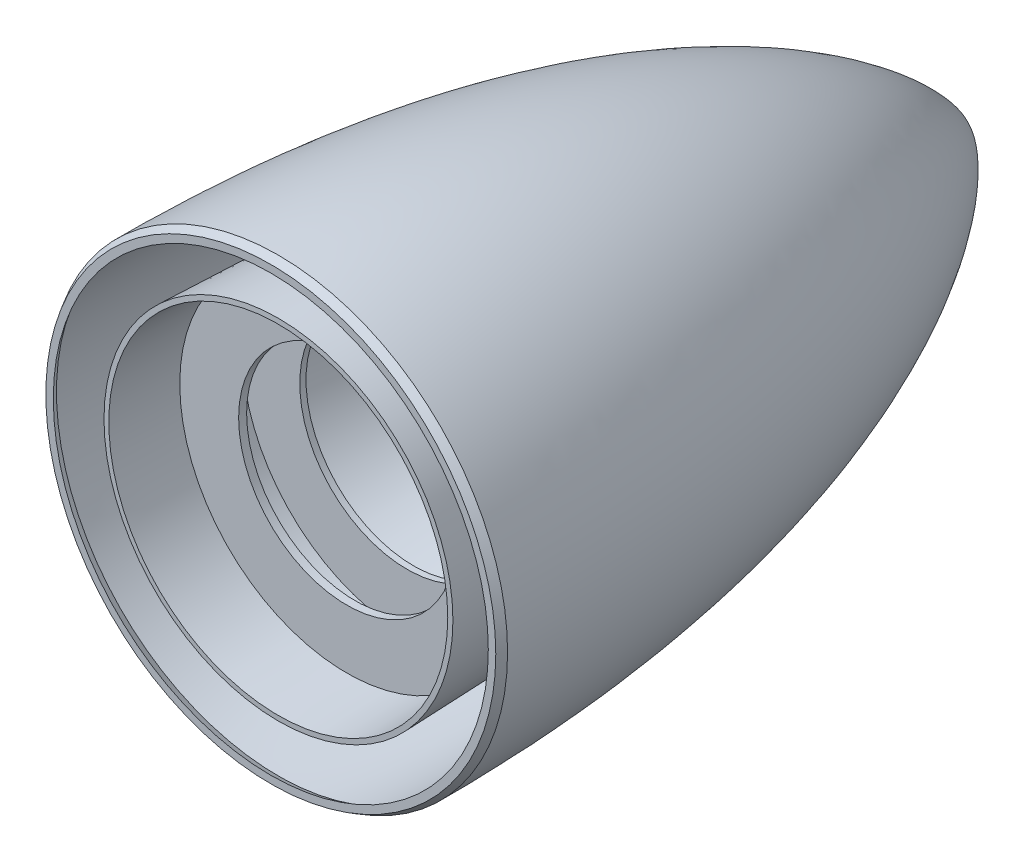
ISO-10303-21;
HEADER;
FILE_DESCRIPTION(('STEP AP214'),'2;1');
FILE_NAME('part.step','',(''),(''),'','','');
FILE_SCHEMA(('AUTOMOTIVE_DESIGN { 1 0 10303 214 1 1 1 1 }'));
ENDSEC;
DATA;
#1=APPLICATION_CONTEXT('core data for automotive mechanical design processes');
#2=APPLICATION_PROTOCOL_DEFINITION('international standard','automotive_design',2000,#1);
#3=PRODUCT_CONTEXT('',#1,'mechanical');
#4=PRODUCT('Part','Part','',(#3));
#5=PRODUCT_RELATED_PRODUCT_CATEGORY('part','',(#4));
#6=PRODUCT_DEFINITION_FORMATION('','',#4);
#7=PRODUCT_DEFINITION_CONTEXT('part definition',#1,'design');
#8=PRODUCT_DEFINITION('design','',#6,#7);
#9=PRODUCT_DEFINITION_SHAPE('','',#8);
#10=(LENGTH_UNIT() NAMED_UNIT(*) SI_UNIT(.MILLI.,.METRE.));
#11=(NAMED_UNIT(*) PLANE_ANGLE_UNIT() SI_UNIT($,.RADIAN.));
#12=(NAMED_UNIT(*) SI_UNIT($,.STERADIAN.) SOLID_ANGLE_UNIT());
#13=UNCERTAINTY_MEASURE_WITH_UNIT(LENGTH_MEASURE(1.E-05),#10,'distance_accuracy_value','');
#14=(GEOMETRIC_REPRESENTATION_CONTEXT(3) GLOBAL_UNCERTAINTY_ASSIGNED_CONTEXT((#13)) GLOBAL_UNIT_ASSIGNED_CONTEXT((#10,
#11,#12)) REPRESENTATION_CONTEXT('',''));
#15=CARTESIAN_POINT('',(0.,0.,0.));
#16=DIRECTION('',(0.,0.,1.));
#17=DIRECTION('',(1.,0.,0.));
#18=AXIS2_PLACEMENT_3D('',#15,#16,#17);
#19=CARTESIAN_POINT('',(0.000427097641021419,0.,-731.633347600807));
#20=DIRECTION('',(0.,0.,-1.));
#21=DIRECTION('',(-1.,0.,0.));
#22=AXIS2_PLACEMENT_3D('',#19,#20,#21);
#23=CONICAL_SURFACE('',#22,435.21,0.523598775598295);
#24=CARTESIAN_POINT('',(0.000427097641021419,0.,-716.963347600807));
#25=DIRECTION('',(0.,0.,1.));
#26=DIRECTION('',(1.,0.,0.));
#27=AXIS2_PLACEMENT_3D('',#24,#25,#26);
#28=CIRCLE('',#27,426.740271550988);
#29=CARTESIAN_POINT('',(426.740698648629,0.,-716.963347600807));
#30=VERTEX_POINT('',#29);
#31=EDGE_CURVE('E66',#30,#30,#28,.T.);
#32=ORIENTED_EDGE('',*,*,#31,.T.);
#33=EDGE_LOOP('',(#32));
#34=FACE_BOUND('',#33,.T.);
#35=CARTESIAN_POINT('',(0.000427097641021419,0.,-731.633347600807));
#36=DIRECTION('',(0.,0.,1.));
#37=DIRECTION('',(1.,0.,0.));
#38=AXIS2_PLACEMENT_3D('',#35,#36,#37);
#39=CIRCLE('',#38,435.21);
#40=CARTESIAN_POINT('',(435.210427097641,0.,-731.633347600807));
#41=VERTEX_POINT('',#40);
#42=EDGE_CURVE('E11',#41,#41,#39,.T.);
#43=ORIENTED_EDGE('',*,*,#42,.F.);
#44=EDGE_LOOP('',(#43));
#45=FACE_BOUND('',#44,.T.);
#46=ADVANCED_FACE('F40',(#34,#45),#23,.F.);
#47=CARTESIAN_POINT('',(0.000427097641021419,435.21,-731.633347600807));
#48=CARTESIAN_POINT('',(0.000427097641021419,435.21,-735.17162098933));
#49=CARTESIAN_POINT('',(0.000427097641021419,435.200275342792,-742.260023271623));
#50=CARTESIAN_POINT('',(0.000427097641021419,435.142181395903,-756.341903960566));
#51=CARTESIAN_POINT('',(0.000427097641021419,434.997581523608,-773.832048589776));
#52=CARTESIAN_POINT('',(0.000427097641021419,434.710413793106,-794.620707104869));
#53=CARTESIAN_POINT('',(0.000427097641021419,434.178025045587,-822.080993490803));
#54=CARTESIAN_POINT('',(0.000427097641021419,433.236039726553,-855.920854673396));
#55=CARTESIAN_POINT('',(0.000427097641021419,431.675451322101,-895.757678379547));
#56=CARTESIAN_POINT('',(0.000427097641021419,429.696850318435,-934.827940537803));
#57=CARTESIAN_POINT('',(0.000427097641021419,426.517623921826,-985.905952349145));
#58=CARTESIAN_POINT('',(0.000427097641021419,421.559529095409,-1047.86087320308));
#59=CARTESIAN_POINT('',(0.000427097641021419,414.132872428489,-1119.21653948984));
#60=CARTESIAN_POINT('',(0.000427097641021419,407.019656539862,-1174.47040860991));
#61=CARTESIAN_POINT('',(0.000427097641021419,400.789299702028,-1216.99407691966));
#62=CARTESIAN_POINT('',(0.000427097641021419,396.764527793166,-1242.41212152504));
#63=CARTESIAN_POINT('',(0.000427097641021419,391.121068354894,-1276.00200150488));
#64=CARTESIAN_POINT('',(0.000427097641021419,383.252939217757,-1319.17433356124));
#65=CARTESIAN_POINT('',(0.000427097641021419,371.60804472283,-1375.49560863428));
#66=CARTESIAN_POINT('',(0.000427097641021419,353.810812231307,-1451.46059944373));
#67=CARTESIAN_POINT('',(0.000427097641021419,329.335423652568,-1539.5107898992));
#68=CARTESIAN_POINT('',(0.000427097641021419,297.179626457108,-1634.42524715194));
#69=CARTESIAN_POINT('',(0.000427097641021419,263.019870146047,-1718.8973889088));
#70=CARTESIAN_POINT('',(0.000427097641021419,227.638704117346,-1793.22968541581));
#71=CARTESIAN_POINT('',(0.000427097641021419,191.82097551996,-1857.72287172244));
#72=CARTESIAN_POINT('',(0.000427097641021419,156.356142182627,-1912.67475508533));
#73=CARTESIAN_POINT('',(0.000427097641021419,127.760916348115,-1950.76129232637));
#74=CARTESIAN_POINT('',(0.000427097641021419,105.868322019769,-1976.74903878227));
#75=CARTESIAN_POINT('',(0.000427097641021419,90.0461688399786,-1994.03351931587));
#76=CARTESIAN_POINT('',(0.000427097641021419,74.929774851098,-2009.14525991876));
#77=CARTESIAN_POINT('',(0.000427097641021419,60.6331712148671,-2022.11657155866));
#78=CARTESIAN_POINT('',(0.000427097641021419,49.5044100661847,-2031.16807013413));
#79=CARTESIAN_POINT('',(0.000427097641021419,41.1412917302037,-2037.36941510258));
#80=CARTESIAN_POINT('',(0.000427097641021419,35.1584679206443,-2041.50423863346));
#81=CARTESIAN_POINT('',(0.000427097641021419,29.4865277261691,-2045.12677159539));
#82=CARTESIAN_POINT('',(0.000427097641021419,25.0389283465247,-2047.72231083128));
#83=CARTESIAN_POINT('',(0.000427097641021419,21.6626585490641,-2049.54729642377));
#84=CARTESIAN_POINT('',(0.000427097641021419,19.224448965899,-2050.79154638529));
#85=CARTESIAN_POINT('',(0.000427097641021419,17.2776811285163,-2051.72412452871));
#86=CARTESIAN_POINT('',(0.000427097641021419,15.7665847633562,-2052.41126170716));
#87=CARTESIAN_POINT('',(0.000427097641021419,15.0390005572221,-2052.73010996812));
#88=CARTESIAN_POINT('',(0.000427097641021419,14.6700000000001,-2052.88867684401));
#89=B_SPLINE_CURVE_WITH_KNOTS('',3,(#47,#48,#49,#50,#51,#52,#53,#54,#55,#56,#57,#58,#59,#60,#61,
#62,#63,#64,#65,#66,#67,#68,#69,#70,#71,#72,#73,#74,#75,#76,#77,#78,#79,#80,#81,#82,#83,#84,#85,
#86,#87,#88),.UNSPECIFIED.,.F.,.F.,(4,1,1,1,1,1,1,1,1,1,1,1,1,1,1,1,1,1,1,1,1,1,1,1,1,1,1,1,1,1,
1,1,1,1,1,1,1,1,1,4),(0.,0.00363993472073978,0.00727986944147956,0.0145597388829591,
0.0218396083244387,0.0291194777659182,0.0436792166488773,0.0582389555318365,0.0727986944147956,
0.0873584332977547,0.116477911063673,0.145597388829591,0.174716866595509,0.187043045326134,
0.201602784209093,0.208882653650573,0.232955822127346,0.262075299893264,0.291194777659182,
0.349433733191019,0.407672688722855,0.465911644254692,0.524150599786528,0.582389555318365,
0.640628510850201,0.698867466382038,0.727986944147956,0.757106421913874,0.786225899679792,
0.81534537744571,0.844464855211629,0.859024594094588,0.873584332977547,0.888144071860506,
0.902703810743465,0.909983680184945,0.917263549626424,0.924543419067904,0.928183353788644,
0.931823288509383),.UNSPECIFIED.);
#90=CARTESIAN_POINT('',(0.000427097641021419,0.,-731.633347600807));
#91=DIRECTION('',(0.,0.,1.));
#92=AXIS1_PLACEMENT('',#90,#91);
#93=SURFACE_OF_REVOLUTION('',#89,#92);
#94=CARTESIAN_POINT('',(0.000427097641021419,0.,-1231.55013848112));
#95=DIRECTION('',(0.,0.,1.));
#96=DIRECTION('',(1.,0.,0.));
#97=AXIS2_PLACEMENT_3D('',#94,#95,#96);
#98=CIRCLE('',#97,398.467014977123);
#99=CARTESIAN_POINT('',(398.467442074764,0.,-1231.55013848112));
#100=VERTEX_POINT('',#99);
#101=EDGE_CURVE('E46',#100,#100,#98,.T.);
#102=ORIENTED_EDGE('',*,*,#101,.F.);
#103=EDGE_LOOP('',(#102));
#104=FACE_BOUND('',#103,.T.);
#105=ORIENTED_EDGE('',*,*,#42,.T.);
#106=EDGE_LOOP('',(#105));
#107=FACE_BOUND('',#106,.T.);
#108=ADVANCED_FACE('F154',(#104,#107),#93,.T.);
#109=CARTESIAN_POINT('',(0.000427097641021419,0.,-1231.55013848112));
#110=DIRECTION('',(0.,0.,-1.));
#111=DIRECTION('',(-1.,0.,0.));
#112=AXIS2_PLACEMENT_3D('',#109,#110,#111);
#113=PLANE('',#112);
#114=CARTESIAN_POINT('',(0.000427097641021419,0.,-1231.55013848112));
#115=DIRECTION('',(0.,0.,1.));
#116=DIRECTION('',(1.,0.,0.));
#117=AXIS2_PLACEMENT_3D('',#114,#115,#116);
#118=CIRCLE('',#117,287.415954961127);
#119=CARTESIAN_POINT('',(287.416382058768,0.,-1231.55013848112));
#120=VERTEX_POINT('',#119);
#121=EDGE_CURVE('E147',#120,#120,#118,.T.);
#122=ORIENTED_EDGE('',*,*,#121,.F.);
#123=EDGE_LOOP('',(#122));
#124=FACE_BOUND('',#123,.T.);
#125=ORIENTED_EDGE('',*,*,#101,.T.);
#126=EDGE_LOOP('',(#125));
#127=FACE_BOUND('',#126,.T.);
#128=ADVANCED_FACE('F152',(#124,#127),#113,.F.);
#129=CARTESIAN_POINT('',(0.000427097641021419,0.,-996.803898489218));
#130=DIRECTION('',(0.,0.,1.));
#131=DIRECTION('',(1.,0.,0.));
#132=AXIS2_PLACEMENT_3D('',#129,#130,#131);
#133=CONICAL_SURFACE('',#132,333.04600165967,0.191986217719373);
#134=ORIENTED_EDGE('',*,*,#121,.T.);
#135=EDGE_LOOP('',(#134));
#136=FACE_BOUND('',#135,.T.);
#137=CARTESIAN_POINT('',(0.000427097641021419,0.,-996.803898489218));
#138=DIRECTION('',(0.,0.,1.));
#139=DIRECTION('',(1.,0.,0.));
#140=AXIS2_PLACEMENT_3D('',#137,#138,#139);
#141=CIRCLE('',#140,333.04600165967);
#142=CARTESIAN_POINT('',(333.046428757311,0.,-996.803898489218));
#143=VERTEX_POINT('',#142);
#144=EDGE_CURVE('E144',#143,#143,#141,.T.);
#145=ORIENTED_EDGE('',*,*,#144,.F.);
#146=EDGE_LOOP('',(#145));
#147=FACE_BOUND('',#146,.T.);
#148=ADVANCED_FACE('F286',(#136,#147),#133,.T.);
#149=CARTESIAN_POINT('',(0.000427097641021419,0.,-731.974664678557));
#150=DIRECTION('',(0.,0.,1.));
#151=DIRECTION('',(1.,0.,0.));
#152=AXIS2_PLACEMENT_3D('',#149,#150,#151);
#153=CONICAL_SURFACE('',#152,342.294042288247,0.0349065850398823);
#154=ORIENTED_EDGE('',*,*,#144,.T.);
#155=EDGE_LOOP('',(#154));
#156=FACE_BOUND('',#155,.T.);
#157=CARTESIAN_POINT('',(0.000427097641021419,0.,-731.974664678557));
#158=DIRECTION('',(0.,0.,1.));
#159=DIRECTION('',(1.,0.,0.));
#160=AXIS2_PLACEMENT_3D('',#157,#158,#159);
#161=CIRCLE('',#160,342.294042288247);
#162=CARTESIAN_POINT('',(342.294469385888,0.,-731.974664678557));
#163=VERTEX_POINT('',#162);
#164=EDGE_CURVE('E141',#163,#163,#161,.T.);
#165=ORIENTED_EDGE('',*,*,#164,.F.);
#166=EDGE_LOOP('',(#165));
#167=FACE_BOUND('',#166,.T.);
#168=ADVANCED_FACE('F282',(#156,#167),#153,.T.);
#169=CARTESIAN_POINT('',(0.000427097641021419,0.,-731.974664678557));
#170=DIRECTION('',(0.,0.,-1.));
#171=DIRECTION('',(-1.,0.,0.));
#172=AXIS2_PLACEMENT_3D('',#169,#170,#171);
#173=CONICAL_SURFACE('',#172,342.294042288247,1.53588974175501);
#174=CARTESIAN_POINT('',(0.000427097641021419,0.,-731.633347600807));
#175=DIRECTION('',(0.,0.,1.));
#176=DIRECTION('',(1.,0.,0.));
#177=AXIS2_PLACEMENT_3D('',#174,#175,#176);
#178=CIRCLE('',#177,332.52);
#179=CARTESIAN_POINT('',(332.520427097641,0.,-731.633347600807));
#180=VERTEX_POINT('',#179);
#181=EDGE_CURVE('E138',#180,#180,#178,.T.);
#182=ORIENTED_EDGE('',*,*,#181,.F.);
#183=EDGE_LOOP('',(#182));
#184=FACE_BOUND('',#183,.T.);
#185=ORIENTED_EDGE('',*,*,#164,.T.);
#186=EDGE_LOOP('',(#185));
#187=FACE_BOUND('',#186,.T.);
#188=ADVANCED_FACE('F278',(#184,#187),#173,.T.);
#189=CARTESIAN_POINT('',(0.000427097641021419,0.,-731.633347600807));
#190=DIRECTION('',(0.,0.,1.));
#191=DIRECTION('',(1.,0.,0.));
#192=AXIS2_PLACEMENT_3D('',#189,#190,#191);
#193=CONICAL_SURFACE('',#192,332.52,0.0349065850398821);
#194=CARTESIAN_POINT('',(0.000427097641021419,0.,-866.19206898026));
#195=DIRECTION('',(0.,0.,1.));
#196=DIRECTION('',(1.,0.,0.));
#197=AXIS2_PLACEMENT_3D('',#194,#195,#196);
#198=CIRCLE('',#197,327.821105907604);
#199=CARTESIAN_POINT('',(327.821533005245,0.,-866.19206898026));
#200=VERTEX_POINT('',#199);
#201=EDGE_CURVE('E135',#200,#200,#198,.T.);
#202=ORIENTED_EDGE('',*,*,#201,.F.);
#203=EDGE_LOOP('',(#202));
#204=FACE_BOUND('',#203,.T.);
#205=ORIENTED_EDGE('',*,*,#181,.T.);
#206=EDGE_LOOP('',(#205));
#207=FACE_BOUND('',#206,.T.);
#208=ADVANCED_FACE('F274',(#204,#207),#193,.F.);
#209=CARTESIAN_POINT('',(0.000427097641021419,0.,-866.19206898026));
#210=DIRECTION('',(0.,0.,-1.));
#211=DIRECTION('',(-1.,0.,0.));
#212=AXIS2_PLACEMENT_3D('',#209,#210,#211);
#213=PLANE('',#212);
#214=CARTESIAN_POINT('',(0.000427097641021419,0.,-866.19206898026));
#215=DIRECTION('',(0.,0.,1.));
#216=DIRECTION('',(1.,0.,0.));
#217=AXIS2_PLACEMENT_3D('',#214,#215,#216);
#218=CIRCLE('',#217,212.363921885813);
#219=CARTESIAN_POINT('',(212.364348983454,0.,-866.19206898026));
#220=VERTEX_POINT('',#219);
#221=EDGE_CURVE('E132',#220,#220,#218,.T.);
#222=ORIENTED_EDGE('',*,*,#221,.F.);
#223=EDGE_LOOP('',(#222));
#224=FACE_BOUND('',#223,.T.);
#225=ORIENTED_EDGE('',*,*,#201,.T.);
#226=EDGE_LOOP('',(#225));
#227=FACE_BOUND('',#226,.T.);
#228=ADVANCED_FACE('F270',(#224,#227),#213,.F.);
#229=CARTESIAN_POINT('',(0.000427097641021419,0.,-731.633347600807));
#230=DIRECTION('',(0.,0.,1.));
#231=DIRECTION('',(1.,0.,0.));
#232=AXIS2_PLACEMENT_3D('',#229,#230,#231);
#233=CYLINDRICAL_SURFACE('',#232,212.363921885813);
#234=ORIENTED_EDGE('',*,*,#221,.T.);
#235=EDGE_LOOP('',(#234));
#236=FACE_BOUND('',#235,.T.);
#237=CARTESIAN_POINT('',(0.000427097641021419,0.,-881.888898489218));
#238=DIRECTION('',(0.,0.,1.));
#239=DIRECTION('',(1.,0.,0.));
#240=AXIS2_PLACEMENT_3D('',#237,#238,#239);
#241=CIRCLE('',#240,212.363921885813);
#242=CARTESIAN_POINT('',(212.364348983454,0.,-881.888898489218));
#243=VERTEX_POINT('',#242);
#244=EDGE_CURVE('E129',#243,#243,#241,.T.);
#245=ORIENTED_EDGE('',*,*,#244,.F.);
#246=EDGE_LOOP('',(#245));
#247=FACE_BOUND('',#246,.T.);
#248=ADVANCED_FACE('F266',(#236,#247),#233,.F.);
#249=CARTESIAN_POINT('',(0.000427097641021419,0.,-881.888898489218));
#250=DIRECTION('',(0.,0.,-1.));
#251=DIRECTION('',(-1.,0.,0.));
#252=AXIS2_PLACEMENT_3D('',#249,#250,#251);
#253=PLANE('',#252);
#254=ORIENTED_EDGE('',*,*,#244,.T.);
#255=EDGE_LOOP('',(#254));
#256=FACE_BOUND('',#255,.T.);
#257=CARTESIAN_POINT('',(0.000427097641021419,0.,-881.888898489218));
#258=DIRECTION('',(0.,0.,1.));
#259=DIRECTION('',(1.,0.,0.));
#260=AXIS2_PLACEMENT_3D('',#257,#258,#259);
#261=CIRCLE('',#260,327.272960542571);
#262=CARTESIAN_POINT('',(327.273387640212,0.,-881.888898489218));
#263=VERTEX_POINT('',#262);
#264=EDGE_CURVE('E126',#263,#263,#261,.T.);
#265=ORIENTED_EDGE('',*,*,#264,.F.);
#266=EDGE_LOOP('',(#265));
#267=FACE_BOUND('',#266,.T.);
#268=ADVANCED_FACE('F262',(#256,#267),#253,.T.);
#269=CARTESIAN_POINT('',(0.000427097641021419,0.,-881.888898489218));
#270=DIRECTION('',(0.,0.,1.));
#271=DIRECTION('',(1.,0.,0.));
#272=AXIS2_PLACEMENT_3D('',#269,#270,#271);
#273=CONICAL_SURFACE('',#272,327.272960542571,0.0349065850398823);
#274=CARTESIAN_POINT('',(0.000427097641021419,0.,-984.578898489218));
#275=DIRECTION('',(0.,0.,1.));
#276=DIRECTION('',(1.,0.,0.));
#277=AXIS2_PLACEMENT_3D('',#274,#275,#276);
#278=CIRCLE('',#277,323.686946723464);
#279=CARTESIAN_POINT('',(323.687373821105,0.,-984.578898489218));
#280=VERTEX_POINT('',#279);
#281=EDGE_CURVE('E123',#280,#280,#278,.T.);
#282=ORIENTED_EDGE('',*,*,#281,.F.);
#283=EDGE_LOOP('',(#282));
#284=FACE_BOUND('',#283,.T.);
#285=ORIENTED_EDGE('',*,*,#264,.T.);
#286=EDGE_LOOP('',(#285));
#287=FACE_BOUND('',#286,.T.);
#288=ADVANCED_FACE('F258',(#284,#287),#273,.F.);
#289=CARTESIAN_POINT('',(0.000427097641021419,0.,-984.578898489218));
#290=DIRECTION('',(0.,0.,-1.));
#291=DIRECTION('',(-1.,0.,0.));
#292=AXIS2_PLACEMENT_3D('',#289,#290,#291);
#293=PLANE('',#292);
#294=CARTESIAN_POINT('',(0.000427097641021419,0.,-984.578898489218));
#295=DIRECTION('',(0.,0.,1.));
#296=DIRECTION('',(1.,0.,0.));
#297=AXIS2_PLACEMENT_3D('',#294,#295,#296);
#298=CIRCLE('',#297,210.79600165967);
#299=CARTESIAN_POINT('',(210.796428757311,0.,-984.578898489218));
#300=VERTEX_POINT('',#299);
#301=EDGE_CURVE('E120',#300,#300,#298,.T.);
#302=ORIENTED_EDGE('',*,*,#301,.F.);
#303=EDGE_LOOP('',(#302));
#304=FACE_BOUND('',#303,.T.);
#305=ORIENTED_EDGE('',*,*,#281,.T.);
#306=EDGE_LOOP('',(#305));
#307=FACE_BOUND('',#306,.T.);
#308=ADVANCED_FACE('F254',(#304,#307),#293,.F.);
#309=CARTESIAN_POINT('',(0.000427097641021419,0.,-731.633347600807));
#310=DIRECTION('',(0.,0.,1.));
#311=DIRECTION('',(1.,0.,0.));
#312=AXIS2_PLACEMENT_3D('',#309,#310,#311);
#313=CYLINDRICAL_SURFACE('',#312,210.79600165967);
#314=ORIENTED_EDGE('',*,*,#301,.T.);
#315=EDGE_LOOP('',(#314));
#316=FACE_BOUND('',#315,.T.);
#317=CARTESIAN_POINT('',(0.000427097641021419,0.,-996.803898489218));
#318=DIRECTION('',(0.,0.,1.));
#319=DIRECTION('',(1.,0.,0.));
#320=AXIS2_PLACEMENT_3D('',#317,#318,#319);
#321=CIRCLE('',#320,210.79600165967);
#322=CARTESIAN_POINT('',(210.796428757311,0.,-996.803898489218));
#323=VERTEX_POINT('',#322);
#324=EDGE_CURVE('E117',#323,#323,#321,.T.);
#325=ORIENTED_EDGE('',*,*,#324,.F.);
#326=EDGE_LOOP('',(#325));
#327=FACE_BOUND('',#326,.T.);
#328=ADVANCED_FACE('F250',(#316,#327),#313,.F.);
#329=CARTESIAN_POINT('',(0.000427097641021419,-2.50547702536838E-13,-996.803898489218));
#330=DIRECTION('',(0.,0.,-1.));
#331=DIRECTION('',(-1.,0.,0.));
#332=AXIS2_PLACEMENT_3D('',#329,#330,#331);
#333=PLANE('',#332);
#334=ORIENTED_EDGE('',*,*,#324,.T.);
#335=EDGE_LOOP('',(#334));
#336=FACE_BOUND('',#335,.T.);
#337=CARTESIAN_POINT('',(0.000427097641021419,0.,-996.803898489218));
#338=DIRECTION('',(0.,0.,1.));
#339=DIRECTION('',(1.,0.,0.));
#340=AXIS2_PLACEMENT_3D('',#337,#338,#339);
#341=CIRCLE('',#340,323.082952383008);
#342=CARTESIAN_POINT('',(323.083379480649,0.,-996.803898489218));
#343=VERTEX_POINT('',#342);
#344=EDGE_CURVE('E114',#343,#343,#341,.T.);
#345=ORIENTED_EDGE('',*,*,#344,.F.);
#346=EDGE_LOOP('',(#345));
#347=FACE_BOUND('',#346,.T.);
#348=ADVANCED_FACE('F246',(#336,#347),#333,.T.);
#349=CARTESIAN_POINT('',(0.000427097641021419,0.,-996.803898489218));
#350=DIRECTION('',(0.,0.,1.));
#351=DIRECTION('',(1.,0.,0.));
#352=AXIS2_PLACEMENT_3D('',#349,#350,#351);
#353=CONICAL_SURFACE('',#352,323.082952383008,0.191986217719373);
#354=CARTESIAN_POINT('',(0.000427097641021419,0.,-1231.55013848112));
#355=DIRECTION('',(0.,0.,1.));
#356=DIRECTION('',(1.,0.,0.));
#357=AXIS2_PLACEMENT_3D('',#354,#355,#356);
#358=CIRCLE('',#357,277.452905684465);
#359=CARTESIAN_POINT('',(277.453332782106,0.,-1231.55013848112));
#360=VERTEX_POINT('',#359);
#361=EDGE_CURVE('E111',#360,#360,#358,.T.);
#362=ORIENTED_EDGE('',*,*,#361,.F.);
#363=EDGE_LOOP('',(#362));
#364=FACE_BOUND('',#363,.T.);
#365=ORIENTED_EDGE('',*,*,#344,.T.);
#366=EDGE_LOOP('',(#365));
#367=FACE_BOUND('',#366,.T.);
#368=ADVANCED_FACE('F242',(#364,#367),#353,.F.);
#369=CARTESIAN_POINT('',(0.000427097641021419,0.,-1231.55013848112));
#370=DIRECTION('',(0.,0.,-1.));
#371=DIRECTION('',(-1.,0.,0.));
#372=AXIS2_PLACEMENT_3D('',#369,#370,#371);
#373=CONICAL_SURFACE('',#372,277.452905684465,0.610783674604799);
#374=CARTESIAN_POINT('',(0.000427097641021419,0.,-1249.97334760081));
#375=DIRECTION('',(0.,0.,1.));
#376=DIRECTION('',(1.,0.,0.));
#377=AXIS2_PLACEMENT_3D('',#374,#375,#376);
#378=CIRCLE('',#377,290.350736311227);
#379=CARTESIAN_POINT('',(290.351163408868,0.,-1249.97334760081));
#380=VERTEX_POINT('',#379);
#381=EDGE_CURVE('E108',#380,#380,#378,.T.);
#382=ORIENTED_EDGE('',*,*,#381,.F.);
#383=EDGE_LOOP('',(#382));
#384=FACE_BOUND('',#383,.T.);
#385=ORIENTED_EDGE('',*,*,#361,.T.);
#386=EDGE_LOOP('',(#385));
#387=FACE_BOUND('',#386,.T.);
#388=ADVANCED_FACE('F238',(#384,#387),#373,.F.);
#389=CARTESIAN_POINT('',(0.000427097641021419,0.,-1249.97334760081));
#390=DIRECTION('',(0.,0.,-1.));
#391=DIRECTION('',(-1.,0.,0.));
#392=AXIS2_PLACEMENT_3D('',#389,#390,#391);
#393=PLANE('',#392);
#394=ORIENTED_EDGE('',*,*,#381,.T.);
#395=EDGE_LOOP('',(#394));
#396=FACE_BOUND('',#395,.T.);
#397=CARTESIAN_POINT('',(0.000427097641021419,0.,-1249.97334760081));
#398=DIRECTION('',(0.,0.,1.));
#399=DIRECTION('',(1.,0.,0.));
#400=AXIS2_PLACEMENT_3D('',#397,#398,#399);
#401=CIRCLE('',#400,359.788736311227);
#402=CARTESIAN_POINT('',(359.789163408868,0.,-1249.97334760081));
#403=VERTEX_POINT('',#402);
#404=EDGE_CURVE('E105',#403,#403,#401,.T.);
#405=ORIENTED_EDGE('',*,*,#404,.F.);
#406=EDGE_LOOP('',(#405));
#407=FACE_BOUND('',#406,.T.);
#408=ADVANCED_FACE('F234',(#396,#407),#393,.T.);
#409=CARTESIAN_POINT('',(0.000427097641021419,0.,-731.633347600807));
#410=DIRECTION('',(0.,0.,1.));
#411=DIRECTION('',(1.,0.,0.));
#412=AXIS2_PLACEMENT_3D('',#409,#410,#411);
#413=CYLINDRICAL_SURFACE('',#412,359.788736311227);
#414=ORIENTED_EDGE('',*,*,#404,.T.);
#415=EDGE_LOOP('',(#414));
#416=FACE_BOUND('',#415,.T.);
#417=CARTESIAN_POINT('',(0.000427097641021419,0.,-1279.31334760081));
#418=DIRECTION('',(0.,0.,1.));
#419=DIRECTION('',(1.,0.,0.));
#420=AXIS2_PLACEMENT_3D('',#417,#418,#419);
#421=CIRCLE('',#420,359.788736311227);
#422=CARTESIAN_POINT('',(359.789163408868,0.,-1279.31334760081));
#423=VERTEX_POINT('',#422);
#424=EDGE_CURVE('E102',#423,#423,#421,.T.);
#425=ORIENTED_EDGE('',*,*,#424,.F.);
#426=EDGE_LOOP('',(#425));
#427=FACE_BOUND('',#426,.T.);
#428=ADVANCED_FACE('F230',(#416,#427),#413,.F.);
#429=CARTESIAN_POINT('',(0.000427097641021419,0.,-1279.31334760081));
#430=DIRECTION('',(0.,0.,1.));
#431=DIRECTION('',(1.,0.,0.));
#432=AXIS2_PLACEMENT_3D('',#429,#430,#431);
#433=PLANE('',#432);
#434=ORIENTED_EDGE('',*,*,#424,.T.);
#435=EDGE_LOOP('',(#434));
#436=FACE_BOUND('',#435,.T.);
#437=CARTESIAN_POINT('',(0.000427097641021419,0.,-1279.31334760081));
#438=DIRECTION('',(0.,0.,1.));
#439=DIRECTION('',(1.,0.,0.));
#440=AXIS2_PLACEMENT_3D('',#437,#438,#439);
#441=CIRCLE('',#440,335.338736311227);
#442=CARTESIAN_POINT('',(335.339163408868,0.,-1279.31334760081));
#443=VERTEX_POINT('',#442);
#444=EDGE_CURVE('E99',#443,#443,#441,.T.);
#445=ORIENTED_EDGE('',*,*,#444,.F.);
#446=EDGE_LOOP('',(#445));
#447=FACE_BOUND('',#446,.T.);
#448=ADVANCED_FACE('F226',(#436,#447),#433,.T.);
#449=CARTESIAN_POINT('',(0.000427097641021419,0.,-731.633347600807));
#450=DIRECTION('',(0.,0.,1.));
#451=DIRECTION('',(1.,0.,0.));
#452=AXIS2_PLACEMENT_3D('',#449,#450,#451);
#453=CYLINDRICAL_SURFACE('',#452,335.338736311227);
#454=ORIENTED_EDGE('',*,*,#444,.T.);
#455=EDGE_LOOP('',(#454));
#456=FACE_BOUND('',#455,.T.);
#457=CARTESIAN_POINT('',(0.000427097641021419,0.,-1320.87834760081));
#458=DIRECTION('',(0.,0.,1.));
#459=DIRECTION('',(1.,0.,0.));
#460=AXIS2_PLACEMENT_3D('',#457,#458,#459);
#461=CIRCLE('',#460,335.338736311227);
#462=CARTESIAN_POINT('',(335.339163408868,0.,-1320.87834760081));
#463=VERTEX_POINT('',#462);
#464=EDGE_CURVE('E96',#463,#463,#461,.T.);
#465=ORIENTED_EDGE('',*,*,#464,.F.);
#466=EDGE_LOOP('',(#465));
#467=FACE_BOUND('',#466,.T.);
#468=ADVANCED_FACE('F222',(#456,#467),#453,.F.);
#469=CARTESIAN_POINT('',(0.000427097641021419,0.,-1320.87834760081));
#470=DIRECTION('',(0.,0.,-1.));
#471=DIRECTION('',(-1.,0.,0.));
#472=AXIS2_PLACEMENT_3D('',#469,#470,#471);
#473=PLANE('',#472);
#474=ORIENTED_EDGE('',*,*,#464,.T.);
#475=EDGE_LOOP('',(#474));
#476=FACE_BOUND('',#475,.T.);
#477=CARTESIAN_POINT('',(0.000427097641021419,0.,-1320.87834760081));
#478=DIRECTION('',(0.,0.,1.));
#479=DIRECTION('',(1.,0.,0.));
#480=AXIS2_PLACEMENT_3D('',#477,#478,#479);
#481=CIRCLE('',#480,354.898736311227);
#482=CARTESIAN_POINT('',(354.899163408868,0.,-1320.87834760081));
#483=VERTEX_POINT('',#482);
#484=EDGE_CURVE('E93',#483,#483,#481,.T.);
#485=ORIENTED_EDGE('',*,*,#484,.F.);
#486=EDGE_LOOP('',(#485));
#487=FACE_BOUND('',#486,.T.);
#488=ADVANCED_FACE('F218',(#476,#487),#473,.T.);
#489=CARTESIAN_POINT('',(0.000427097641021419,0.,-1752.63542231233));
#490=DIRECTION('',(0.,0.,1.));
#491=DIRECTION('',(1.,0.,0.));
#492=AXIS2_PLACEMENT_3D('',#489,#490,#491);
#493=CONICAL_SURFACE('',#492,144.316740630556,0.453785605518519);
#494=ORIENTED_EDGE('',*,*,#484,.T.);
#495=EDGE_LOOP('',(#494));
#496=FACE_BOUND('',#495,.T.);
#497=CARTESIAN_POINT('',(0.000427097641021419,0.,-1752.63542231233));
#498=DIRECTION('',(0.,0.,1.));
#499=DIRECTION('',(1.,0.,0.));
#500=AXIS2_PLACEMENT_3D('',#497,#498,#499);
#501=CIRCLE('',#500,144.316740630556);
#502=CARTESIAN_POINT('',(144.317167728197,0.,-1752.63542231233));
#503=VERTEX_POINT('',#502);
#504=EDGE_CURVE('E90',#503,#503,#501,.T.);
#505=ORIENTED_EDGE('',*,*,#504,.F.);
#506=EDGE_LOOP('',(#505));
#507=FACE_BOUND('',#506,.T.);
#508=ADVANCED_FACE('F214',(#496,#507),#493,.F.);
#509=CARTESIAN_POINT('',(0.000427097641021419,0.,-1752.63542231233));
#510=DIRECTION('',(0.,0.,1.));
#511=DIRECTION('',(1.,0.,0.));
#512=AXIS2_PLACEMENT_3D('',#509,#510,#511);
#513=PLANE('',#512);
#514=ORIENTED_EDGE('',*,*,#504,.T.);
#515=EDGE_LOOP('',(#514));
#516=FACE_BOUND('',#515,.T.);
#517=CARTESIAN_POINT('',(0.000427097641021419,0.,-1752.63542231233));
#518=DIRECTION('',(0.,0.,1.));
#519=DIRECTION('',(1.,0.,0.));
#520=AXIS2_PLACEMENT_3D('',#517,#518,#519);
#521=CIRCLE('',#520,81.7526678157);
#522=CARTESIAN_POINT('',(81.7530949133411,0.,-1752.63542231233));
#523=VERTEX_POINT('',#522);
#524=EDGE_CURVE('E87',#523,#523,#521,.T.);
#525=ORIENTED_EDGE('',*,*,#524,.F.);
#526=EDGE_LOOP('',(#525));
#527=FACE_BOUND('',#526,.T.);
#528=ADVANCED_FACE('F210',(#516,#527),#513,.T.);
#529=CARTESIAN_POINT('',(0.000427097641021419,0.,-731.633347600807));
#530=DIRECTION('',(0.,0.,1.));
#531=DIRECTION('',(1.,0.,0.));
#532=AXIS2_PLACEMENT_3D('',#529,#530,#531);
#533=CYLINDRICAL_SURFACE('',#532,81.7526678157);
#534=ORIENTED_EDGE('',*,*,#524,.T.);
#535=EDGE_LOOP('',(#534));
#536=FACE_BOUND('',#535,.T.);
#537=CARTESIAN_POINT('',(0.000427097641021419,0.,-1740.89942231233));
#538=DIRECTION('',(0.,0.,1.));
#539=DIRECTION('',(1.,0.,0.));
#540=AXIS2_PLACEMENT_3D('',#537,#538,#539);
#541=CIRCLE('',#540,81.7526678157);
#542=CARTESIAN_POINT('',(81.7530949133411,0.,-1740.89942231233));
#543=VERTEX_POINT('',#542);
#544=EDGE_CURVE('E84',#543,#543,#541,.T.);
#545=ORIENTED_EDGE('',*,*,#544,.F.);
#546=EDGE_LOOP('',(#545));
#547=FACE_BOUND('',#546,.T.);
#548=ADVANCED_FACE('F206',(#536,#547),#533,.T.);
#549=CARTESIAN_POINT('',(0.000427097641021419,0.,-1744.57181231233));
#550=DIRECTION('',(0.,0.,1.));
#551=DIRECTION('',(1.,0.,0.));
#552=AXIS2_PLACEMENT_3D('',#549,#550,#551);
#553=CONICAL_SURFACE('',#552,39.7770580395626,1.48352986419518);
#554=ORIENTED_EDGE('',*,*,#544,.T.);
#555=EDGE_LOOP('',(#554));
#556=FACE_BOUND('',#555,.T.);
#557=CARTESIAN_POINT('',(0.000427097641021419,0.,-1744.57181231233));
#558=DIRECTION('',(0.,0.,1.));
#559=DIRECTION('',(1.,0.,0.));
#560=AXIS2_PLACEMENT_3D('',#557,#558,#559);
#561=CIRCLE('',#560,39.7770580395626);
#562=CARTESIAN_POINT('',(39.7774851372037,0.,-1744.57181231233));
#563=VERTEX_POINT('',#562);
#564=EDGE_CURVE('E81',#563,#563,#561,.T.);
#565=ORIENTED_EDGE('',*,*,#564,.F.);
#566=EDGE_LOOP('',(#565));
#567=FACE_BOUND('',#566,.T.);
#568=ADVANCED_FACE('F202',(#556,#567),#553,.F.);
#569=CARTESIAN_POINT('',(0.000427097641021419,0.,-731.633347600807));
#570=DIRECTION('',(0.,0.,1.));
#571=DIRECTION('',(1.,0.,0.));
#572=AXIS2_PLACEMENT_3D('',#569,#570,#571);
#573=CYLINDRICAL_SURFACE('',#572,39.7770580395626);
#574=ORIENTED_EDGE('',*,*,#564,.T.);
#575=EDGE_LOOP('',(#574));
#576=FACE_BOUND('',#575,.T.);
#577=CARTESIAN_POINT('',(0.000427097641021419,0.,-1771.46681231233));
#578=DIRECTION('',(0.,0.,1.));
#579=DIRECTION('',(1.,0.,0.));
#580=AXIS2_PLACEMENT_3D('',#577,#578,#579);
#581=CIRCLE('',#580,39.7770580395626);
#582=CARTESIAN_POINT('',(39.7774851372037,0.,-1771.46681231233));
#583=VERTEX_POINT('',#582);
#584=EDGE_CURVE('E78',#583,#583,#581,.T.);
#585=ORIENTED_EDGE('',*,*,#584,.F.);
#586=EDGE_LOOP('',(#585));
#587=FACE_BOUND('',#586,.T.);
#588=ADVANCED_FACE('F198',(#576,#587),#573,.F.);
#589=CARTESIAN_POINT('',(0.000427097641021419,0.,-1771.46681231233));
#590=DIRECTION('',(0.,0.,-1.));
#591=DIRECTION('',(-1.,0.,0.));
#592=AXIS2_PLACEMENT_3D('',#589,#590,#591);
#593=PLANE('',#592);
#594=ORIENTED_EDGE('',*,*,#584,.T.);
#595=EDGE_LOOP('',(#594));
#596=FACE_BOUND('',#595,.T.);
#597=CARTESIAN_POINT('',(0.000427097641021419,0.,-1771.46681231233));
#598=DIRECTION('',(0.,0.,1.));
#599=DIRECTION('',(1.,0.,0.));
#600=AXIS2_PLACEMENT_3D('',#597,#598,#599);
#601=CIRCLE('',#600,135.132058039563);
#602=CARTESIAN_POINT('',(135.132485137204,0.,-1771.46681231233));
#603=VERTEX_POINT('',#602);
#604=EDGE_CURVE('E75',#603,#603,#601,.T.);
#605=ORIENTED_EDGE('',*,*,#604,.F.);
#606=EDGE_LOOP('',(#605));
#607=FACE_BOUND('',#606,.T.);
#608=ADVANCED_FACE('F194',(#596,#607),#593,.T.);
#609=CARTESIAN_POINT('',(0.000427097641021419,0.,-2007.92334760081));
#610=DIRECTION('',(0.,0.,1.));
#611=DIRECTION('',(1.,0.,0.));
#612=AXIS2_PLACEMENT_3D('',#609,#610,#611);
#613=CONICAL_SURFACE('',#612,19.8045,0.45378560551852);
#614=CARTESIAN_POINT('',(0.000427097641021419,0.,-2007.92334760081));
#615=DIRECTION('',(0.,0.,1.));
#616=DIRECTION('',(1.,0.,0.));
#617=AXIS2_PLACEMENT_3D('',#614,#615,#616);
#618=CIRCLE('',#617,19.8045);
#619=CARTESIAN_POINT('',(19.8049270976409,0.,-2007.92334760081));
#620=VERTEX_POINT('',#619);
#621=EDGE_CURVE('E72',#620,#620,#618,.T.);
#622=CARTESIAN_POINT('',(135.132485137204,0.,-1771.46681231233));
#623=CARTESIAN_POINT('',(133.931156407625,0.,-1773.92990122158));
#624=CARTESIAN_POINT('',(132.729827678046,0.,-1776.39299013084));
#625=CARTESIAN_POINT('',(130.327170218889,0.,-1781.31916794935));
#626=CARTESIAN_POINT('',(129.12584148931,0.,-1783.7822568586));
#627=CARTESIAN_POINT('',(126.723184030152,0.,-1788.70843467711));
#628=CARTESIAN_POINT('',(125.521855300573,0.,-1791.17152358637));
#629=CARTESIAN_POINT('',(123.119197841416,0.,-1796.09770140488));
#630=CARTESIAN_POINT('',(121.917869111837,0.,-1798.56079031413));
#631=CARTESIAN_POINT('',(119.51521165268,0.,-1803.48696813264));
#632=CARTESIAN_POINT('',(118.313882923101,0.,-1805.9500570419));
#633=CARTESIAN_POINT('',(115.911225463943,0.,-1810.87623486041));
#634=CARTESIAN_POINT('',(114.709896734364,0.,-1813.33932376966));
#635=CARTESIAN_POINT('',(112.307239275207,0.,-1818.26550158817));
#636=CARTESIAN_POINT('',(111.105910545628,0.,-1820.72859049743));
#637=CARTESIAN_POINT('',(108.703253086471,0.,-1825.65476831594));
#638=CARTESIAN_POINT('',(107.501924356892,0.,-1828.11785722519));
#639=CARTESIAN_POINT('',(105.099266897734,0.,-1833.0440350437));
#640=CARTESIAN_POINT('',(103.897938168155,0.,-1835.50712395296));
#641=CARTESIAN_POINT('',(101.495280708998,0.,-1840.43330177147));
#642=CARTESIAN_POINT('',(100.293951979419,0.,-1842.89639068072));
#643=CARTESIAN_POINT('',(97.8912945202615,0.,-1847.82256849923));
#644=CARTESIAN_POINT('',(96.6899657906828,0.,-1850.28565740849));
#645=CARTESIAN_POINT('',(94.2873083315252,0.,-1855.211835227));
#646=CARTESIAN_POINT('',(93.0859796019464,0.,-1857.67492413625));
#647=CARTESIAN_POINT('',(90.6833221427889,0.,-1862.60110195476));
#648=CARTESIAN_POINT('',(89.4819934132101,0.,-1865.06419086402));
#649=CARTESIAN_POINT('',(87.0793359540525,0.,-1869.99036868253));
#650=CARTESIAN_POINT('',(85.8780072244737,0.,-1872.45345759178));
#651=CARTESIAN_POINT('',(83.4753497653162,0.,-1877.37963541029));
#652=CARTESIAN_POINT('',(82.2740210357374,0.,-1879.84272431955));
#653=CARTESIAN_POINT('',(79.8713635765799,0.,-1884.76890213806));
#654=CARTESIAN_POINT('',(78.6700348470011,0.,-1887.23199104731));
#655=CARTESIAN_POINT('',(76.2673773878435,0.,-1892.15816886582));
#656=CARTESIAN_POINT('',(75.0660486582647,0.,-1894.62125777508));
#657=CARTESIAN_POINT('',(72.6633911991072,0.,-1899.54743559359));
#658=CARTESIAN_POINT('',(71.4620624695284,0.,-1902.01052450284));
#659=CARTESIAN_POINT('',(69.0594050103708,0.,-1906.93670232135));
#660=CARTESIAN_POINT('',(67.858076280792,0.,-1909.39979123061));
#661=CARTESIAN_POINT('',(65.4554188216345,0.,-1914.32596904912));
#662=CARTESIAN_POINT('',(64.2540900920557,0.,-1916.78905795837));
#663=CARTESIAN_POINT('',(61.8514326328982,0.,-1921.71523577688));
#664=CARTESIAN_POINT('',(60.6501039033194,0.,-1924.17832468614));
#665=CARTESIAN_POINT('',(58.2474464441618,0.,-1929.10450250465));
#666=CARTESIAN_POINT('',(57.0461177145831,0.,-1931.5675914139));
#667=CARTESIAN_POINT('',(54.6434602554255,0.,-1936.49376923241));
#668=CARTESIAN_POINT('',(53.4421315258467,0.,-1938.95685814167));
#669=CARTESIAN_POINT('',(51.0394740666891,0.,-1943.88303596018));
#670=CARTESIAN_POINT('',(49.8381453371104,0.,-1946.34612486943));
#671=CARTESIAN_POINT('',(47.4354878779528,0.,-1951.27230268794));
#672=CARTESIAN_POINT('',(46.2341591483741,0.,-1953.7353915972));
#673=CARTESIAN_POINT('',(43.8315016892165,0.,-1958.66156941571));
#674=CARTESIAN_POINT('',(42.6301729596377,0.,-1961.12465832496));
#675=CARTESIAN_POINT('',(40.2275155004801,0.,-1966.05083614347));
#676=CARTESIAN_POINT('',(39.0261867709014,0.,-1968.51392505273));
#677=CARTESIAN_POINT('',(36.6235293117438,0.,-1973.44010287124));
#678=CARTESIAN_POINT('',(35.422200582165,0.,-1975.90319178049));
#679=CARTESIAN_POINT('',(33.0195431230075,0.,-1980.829369599));
#680=CARTESIAN_POINT('',(31.8182143934287,0.,-1983.29245850826));
#681=CARTESIAN_POINT('',(29.4155569342711,0.,-1988.21863632677));
#682=CARTESIAN_POINT('',(28.2142282046923,0.,-1990.68172523602));
#683=CARTESIAN_POINT('',(25.8115707455348,0.,-1995.60790305453));
#684=CARTESIAN_POINT('',(24.610242015956,0.,-1998.07099196379));
#685=CARTESIAN_POINT('',(22.2075845567985,0.,-2002.9971697823));
#686=CARTESIAN_POINT('',(21.0062558272197,0.,-2005.46025869155));
#687=CARTESIAN_POINT('',(19.8049270976409,0.,-2007.92334760081));
#688=B_SPLINE_CURVE_WITH_KNOTS('',3,(#622,#623,#624,#625,#626,#627,#628,#629,#630,#631,#632,
#633,#634,#635,#636,#637,#638,#639,#640,#641,#642,#643,#644,#645,#646,#647,#648,#649,#650,#651,
#652,#653,#654,#655,#656,#657,#658,#659,#660,#661,#662,#663,#664,#665,#666,#667,#668,#669,#670,
#671,#672,#673,#674,#675,#676,#677,#678,#679,#680,#681,#682,#683,#684,#685,#686,#687),
.UNSPECIFIED.,.F.,.F.,(4,2,2,2,2,2,2,2,2,2,2,2,2,2,2,2,2,2,2,2,2,2,2,2,2,2,2,2,2,2,2,2,4),(0.,
8.22131249999993,16.4426249999999,24.6639375,32.8852499999999,41.1065625,49.3278749999999,
57.5491875000001,65.7705,73.9918124999999,82.213125,90.4344375,98.6557499999999,106.8770625,
115.098375,123.3196875,131.541,139.7623125,147.983625,156.2049375,164.42625,172.6475625,
180.868875,189.0901875,197.3115,205.5328125,213.754125,221.9754375,230.19675,238.4180625,
246.639375,254.8606875,263.082),.UNSPECIFIED.);
#689=EDGE_CURVE('BSEAM190',#603,#620,#688,.T.);
#690=ORIENTED_EDGE('',*,*,#604,.T.);
#691=ORIENTED_EDGE('',*,*,#621,.F.);
#692=ORIENTED_EDGE('',*,*,#689,.T.);
#693=ORIENTED_EDGE('',*,*,#689,.F.);
#694=EDGE_LOOP('',(#690,#692,#691,#693));
#695=FACE_BOUND('',#694,.T.);
#696=ADVANCED_FACE('F190',(#695),#613,.F.);
#697=CARTESIAN_POINT('',(0.000427097641021419,0.,-2007.92334760081));
#698=DIRECTION('',(0.,0.,1.));
#699=DIRECTION('',(1.,0.,0.));
#700=AXIS2_PLACEMENT_3D('',#697,#698,#699);
#701=PLANE('',#700);
#702=ORIENTED_EDGE('',*,*,#621,.T.);
#703=EDGE_LOOP('',(#702));
#704=FACE_BOUND('',#703,.T.);
#705=CARTESIAN_POINT('',(0.000427097641021419,0.,-2007.92334760081));
#706=DIRECTION('',(0.,0.,1.));
#707=DIRECTION('',(1.,0.,0.));
#708=AXIS2_PLACEMENT_3D('',#705,#706,#707);
#709=CIRCLE('',#708,3.17849999999999);
#710=CARTESIAN_POINT('',(3.17892709764101,0.,-2007.92334760081));
#711=VERTEX_POINT('',#710);
#712=EDGE_CURVE('E63',#711,#711,#709,.T.);
#713=ORIENTED_EDGE('',*,*,#712,.F.);
#714=EDGE_LOOP('',(#713));
#715=FACE_BOUND('',#714,.T.);
#716=ADVANCED_FACE('F186',(#704,#715),#701,.T.);
#717=CARTESIAN_POINT('',(0.000427097641021419,0.,-731.633347600807));
#718=DIRECTION('',(0.,0.,1.));
#719=DIRECTION('',(1.,0.,0.));
#720=AXIS2_PLACEMENT_3D('',#717,#718,#719);
#721=CYLINDRICAL_SURFACE('',#720,3.17849999999999);
#722=ORIENTED_EDGE('',*,*,#712,.T.);
#723=EDGE_LOOP('',(#722));
#724=FACE_BOUND('',#723,.T.);
#725=CARTESIAN_POINT('',(0.000427097641021419,0.,-2002.05534760081));
#726=DIRECTION('',(0.,0.,1.));
#727=DIRECTION('',(1.,0.,0.));
#728=AXIS2_PLACEMENT_3D('',#725,#726,#727);
#729=CIRCLE('',#728,3.17849999999999);
#730=CARTESIAN_POINT('',(3.17892709764101,0.,-2002.05534760081));
#731=VERTEX_POINT('',#730);
#732=EDGE_CURVE('E59',#731,#731,#729,.T.);
#733=ORIENTED_EDGE('',*,*,#732,.F.);
#734=EDGE_LOOP('',(#733));
#735=FACE_BOUND('',#734,.T.);
#736=ADVANCED_FACE('F182',(#724,#735),#721,.T.);
#737=CARTESIAN_POINT('',(0.000427097641021419,0.,-2002.05534760081));
#738=DIRECTION('',(0.,0.,1.));
#739=DIRECTION('',(1.,0.,0.));
#740=AXIS2_PLACEMENT_3D('',#737,#738,#739);
#741=PLANE('',#740);
#742=ORIENTED_EDGE('',*,*,#732,.T.);
#743=EDGE_LOOP('',(#742));
#744=FACE_BOUND('',#743,.T.);
#745=ADVANCED_FACE('F53',(#744),#741,.T.);
#746=CARTESIAN_POINT('',(0.000427097641021419,449.88,-731.633347600807));
#747=CARTESIAN_POINT('',(0.000427097641021419,449.88,-1709.63334760081));
#748=CARTESIAN_POINT('',(0.000427097641021419,81.5,-2071.49334760081));
#749=CARTESIAN_POINT('',(0.000427097641021419,0.,-2071.49334760081));
#750=B_SPLINE_CURVE_WITH_KNOTS('',3,(#746,#747,#748,#749),.UNSPECIFIED.,.F.,.F.,(4,4),(0.,1.),.UNSPECIFIED.);
#751=CARTESIAN_POINT('',(0.000427097641021419,0.,-731.633347600807));
#752=DIRECTION('',(0.,0.,1.));
#753=AXIS1_PLACEMENT('',#751,#752);
#754=SURFACE_OF_REVOLUTION('',#750,#753);
#755=CARTESIAN_POINT('',(0.000427097641021419,1.490565843328E-13,-2071.49334760081));
#756=VERTEX_POINT('',#755);
#757=VERTEX_LOOP('',#756);
#758=FACE_BOUND('',#757,.T.);
#759=CARTESIAN_POINT('',(0.000427097641021419,0.,-731.633347600807));
#760=DIRECTION('',(0.,0.,1.));
#761=DIRECTION('',(1.,0.,0.));
#762=AXIS2_PLACEMENT_3D('',#759,#760,#761);
#763=CIRCLE('',#762,449.88);
#764=CARTESIAN_POINT('',(449.880427097641,0.,-731.633347600807));
#765=VERTEX_POINT('',#764);
#766=EDGE_CURVE('E57',#765,#765,#763,.T.);
#767=ORIENTED_EDGE('',*,*,#766,.F.);
#768=EDGE_LOOP('',(#767));
#769=FACE_BOUND('',#768,.T.);
#770=ADVANCED_FACE('F49',(#758,#769),#754,.F.);
#771=CARTESIAN_POINT('',(0.000427097641021419,0.,-731.633347600807));
#772=DIRECTION('',(0.,0.,-1.));
#773=DIRECTION('',(-1.,0.,0.));
#774=AXIS2_PLACEMENT_3D('',#771,#772,#773);
#775=CONICAL_SURFACE('',#774,449.88,0.523598775598295);
#776=CARTESIAN_POINT('',(0.000427097641021419,0.,-716.963347600807));
#777=DIRECTION('',(0.,0.,1.));
#778=DIRECTION('',(1.,0.,0.));
#779=AXIS2_PLACEMENT_3D('',#776,#777,#778);
#780=CIRCLE('',#779,441.410271550988);
#781=CARTESIAN_POINT('',(441.410698648629,0.,-716.963347600807));
#782=VERTEX_POINT('',#781);
#783=EDGE_CURVE('E60',#782,#782,#780,.T.);
#784=ORIENTED_EDGE('',*,*,#783,.F.);
#785=EDGE_LOOP('',(#784));
#786=FACE_BOUND('',#785,.T.);
#787=ORIENTED_EDGE('',*,*,#766,.T.);
#788=EDGE_LOOP('',(#787));
#789=FACE_BOUND('',#788,.T.);
#790=ADVANCED_FACE('F52',(#786,#789),#775,.T.);
#791=CARTESIAN_POINT('',(0.000427097641021419,0.,-716.963347600807));
#792=DIRECTION('',(0.,0.,-1.));
#793=DIRECTION('',(-1.,0.,0.));
#794=AXIS2_PLACEMENT_3D('',#791,#792,#793);
#795=PLANE('',#794);
#796=ORIENTED_EDGE('',*,*,#31,.F.);
#797=EDGE_LOOP('',(#796));
#798=FACE_BOUND('',#797,.T.);
#799=ORIENTED_EDGE('',*,*,#783,.T.);
#800=EDGE_LOOP('',(#799));
#801=FACE_BOUND('',#800,.T.);
#802=ADVANCED_FACE('F425',(#798,#801),#795,.F.);
#803=CLOSED_SHELL('',(#46,#108,#128,#148,#168,#188,#208,#228,#248,#268,#288,#308,#328,#348,#368,
#388,#408,#428,#448,#468,#488,#508,#528,#548,#568,#588,#608,#696,#716,#736,#745,#770,#790,#802));
#804=MANIFOLD_SOLID_BREP('B2',#803);
#805=ADVANCED_BREP_SHAPE_REPRESENTATION('',(#18,#804),#14);
#806=SHAPE_DEFINITION_REPRESENTATION(#9,#805);
ENDSEC;
END-ISO-10303-21;
